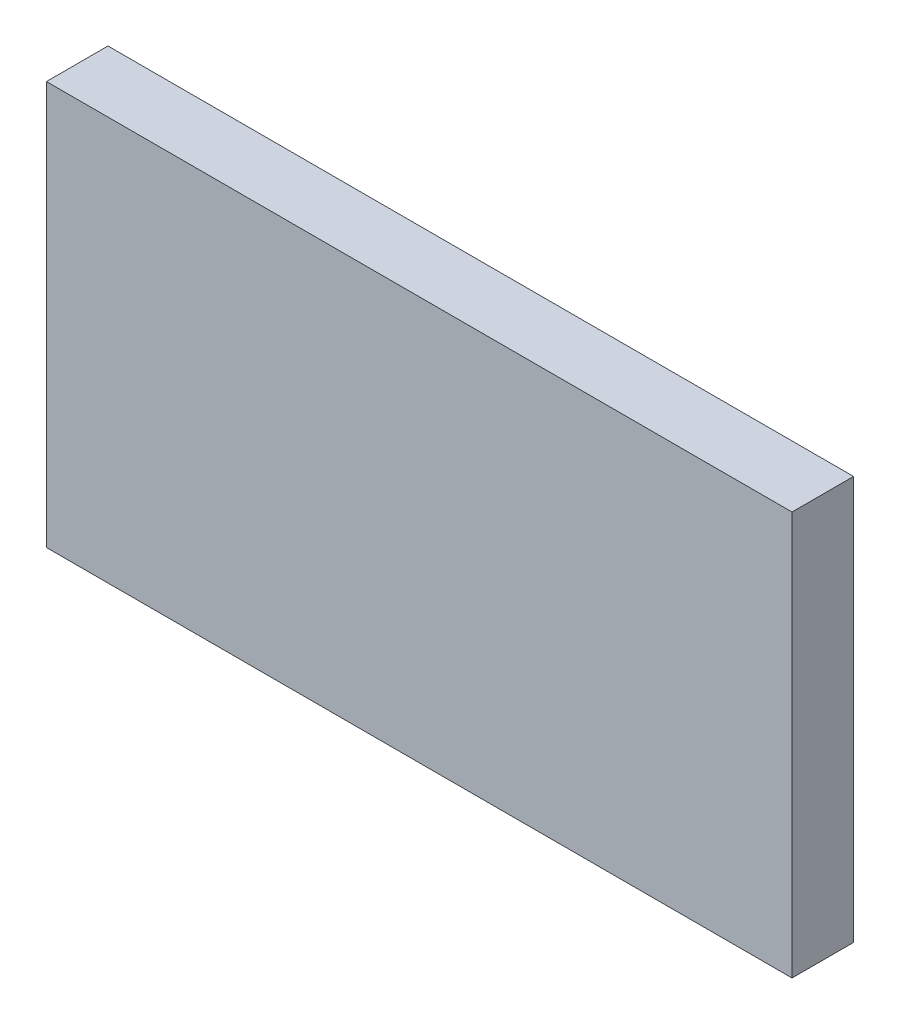
ISO-10303-21;
HEADER;
FILE_DESCRIPTION(('STEP AP214'),'2;1');
FILE_NAME('part.step','',(''),(''),'','','');
FILE_SCHEMA(('AUTOMOTIVE_DESIGN { 1 0 10303 214 1 1 1 1 }'));
ENDSEC;
DATA;
#1=APPLICATION_CONTEXT('core data for automotive mechanical design processes');
#2=APPLICATION_PROTOCOL_DEFINITION('international standard','automotive_design',2000,#1);
#3=PRODUCT_CONTEXT('',#1,'mechanical');
#4=PRODUCT('Part','Part','',(#3));
#5=PRODUCT_RELATED_PRODUCT_CATEGORY('part','',(#4));
#6=PRODUCT_DEFINITION_FORMATION('','',#4);
#7=PRODUCT_DEFINITION_CONTEXT('part definition',#1,'design');
#8=PRODUCT_DEFINITION('design','',#6,#7);
#9=PRODUCT_DEFINITION_SHAPE('','',#8);
#10=(LENGTH_UNIT() NAMED_UNIT(*) SI_UNIT(.MILLI.,.METRE.));
#11=(NAMED_UNIT(*) PLANE_ANGLE_UNIT() SI_UNIT($,.RADIAN.));
#12=(NAMED_UNIT(*) SI_UNIT($,.STERADIAN.) SOLID_ANGLE_UNIT());
#13=UNCERTAINTY_MEASURE_WITH_UNIT(LENGTH_MEASURE(1.E-05),#10,'distance_accuracy_value','');
#14=(GEOMETRIC_REPRESENTATION_CONTEXT(3) GLOBAL_UNCERTAINTY_ASSIGNED_CONTEXT((#13)) GLOBAL_UNIT_ASSIGNED_CONTEXT((#10,
#11,#12)) REPRESENTATION_CONTEXT('',''));
#15=CARTESIAN_POINT('',(0.,0.,0.));
#16=DIRECTION('',(0.,0.,1.));
#17=DIRECTION('',(1.,0.,0.));
#18=AXIS2_PLACEMENT_3D('',#15,#16,#17);
#19=CARTESIAN_POINT('',(0.,0.,0.));
#20=DIRECTION('',(0.,0.,1.));
#21=DIRECTION('',(1.,0.,0.));
#22=AXIS2_PLACEMENT_3D('',#19,#20,#21);
#23=PLANE('',#22);
#24=DIRECTION('',(0.,-1.,0.));
#25=VECTOR('',#24,1.);
#26=CARTESIAN_POINT('',(0.,0.,0.));
#27=LINE('',#26,#25);
#28=CARTESIAN_POINT('',(0.,0.,0.));
#29=VERTEX_POINT('',#28);
#30=CARTESIAN_POINT('',(0.,-59.,0.));
#31=VERTEX_POINT('',#30);
#32=EDGE_CURVE('E221',#29,#31,#27,.T.);
#33=ORIENTED_EDGE('',*,*,#32,.F.);
#34=DIRECTION('',(-1.,0.,0.));
#35=VECTOR('',#34,1.);
#36=CARTESIAN_POINT('',(0.,0.,0.));
#37=LINE('',#36,#35);
#38=CARTESIAN_POINT('',(109.,0.,0.));
#39=VERTEX_POINT('',#38);
#40=EDGE_CURVE('E236',#39,#29,#37,.T.);
#41=ORIENTED_EDGE('',*,*,#40,.F.);
#42=DIRECTION('',(0.,1.,0.));
#43=VECTOR('',#42,1.);
#44=CARTESIAN_POINT('',(109.,-59.,0.));
#45=LINE('',#44,#43);
#46=CARTESIAN_POINT('',(109.,-59.,0.));
#47=VERTEX_POINT('',#46);
#48=EDGE_CURVE('E247',#47,#39,#45,.T.);
#49=ORIENTED_EDGE('',*,*,#48,.F.);
#50=DIRECTION('',(1.,0.,0.));
#51=VECTOR('',#50,1.);
#52=CARTESIAN_POINT('',(0.,-59.,0.));
#53=LINE('',#52,#51);
#54=EDGE_CURVE('E245',#31,#47,#53,.T.);
#55=ORIENTED_EDGE('',*,*,#54,.F.);
#56=EDGE_LOOP('',(#33,#41,#49,#55));
#57=FACE_BOUND('',#56,.T.);
#58=DIRECTION('',(-1.,0.,0.));
#59=VECTOR('',#58,1.);
#60=CARTESIAN_POINT('',(3.,-3.,0.));
#61=LINE('',#60,#59);
#62=CARTESIAN_POINT('',(106.,-3.,0.));
#63=VERTEX_POINT('',#62);
#64=CARTESIAN_POINT('',(3.00000000000001,-3.,0.));
#65=VERTEX_POINT('',#64);
#66=EDGE_CURVE('E214',#63,#65,#61,.T.);
#67=ORIENTED_EDGE('',*,*,#66,.T.);
#68=DIRECTION('',(0.,-1.,0.));
#69=VECTOR('',#68,1.);
#70=CARTESIAN_POINT('',(3.,-3.,0.));
#71=LINE('',#70,#69);
#72=CARTESIAN_POINT('',(3.00000000000001,-56.,0.));
#73=VERTEX_POINT('',#72);
#74=EDGE_CURVE('E210',#65,#73,#71,.T.);
#75=ORIENTED_EDGE('',*,*,#74,.T.);
#76=DIRECTION('',(1.,0.,0.));
#77=VECTOR('',#76,1.);
#78=CARTESIAN_POINT('',(106.,-56.,0.));
#79=LINE('',#78,#77);
#80=CARTESIAN_POINT('',(106.,-56.,0.));
#81=VERTEX_POINT('',#80);
#82=EDGE_CURVE('E224',#73,#81,#79,.T.);
#83=ORIENTED_EDGE('',*,*,#82,.T.);
#84=DIRECTION('',(0.,1.,0.));
#85=VECTOR('',#84,1.);
#86=CARTESIAN_POINT('',(106.,-3.,0.));
#87=LINE('',#86,#85);
#88=EDGE_CURVE('E227',#81,#63,#87,.T.);
#89=ORIENTED_EDGE('',*,*,#88,.T.);
#90=EDGE_LOOP('',(#67,#75,#83,#89));
#91=FACE_BOUND('',#90,.T.);
#92=ADVANCED_FACE('F33',(#57,#91),#23,.F.);
#93=CARTESIAN_POINT('',(96.,-3.,9.));
#94=DIRECTION('',(1.,0.,0.));
#95=DIRECTION('',(0.,0.,-1.));
#96=AXIS2_PLACEMENT_3D('',#93,#94,#95);
#97=PLANE('',#96);
#98=DIRECTION('',(0.,-1.,0.));
#99=VECTOR('',#98,1.);
#100=CARTESIAN_POINT('',(96.,-13.,2.));
#101=LINE('',#100,#99);
#102=CARTESIAN_POINT('',(96.,-3.,2.));
#103=VERTEX_POINT('',#102);
#104=CARTESIAN_POINT('',(96.,-13.,2.));
#105=VERTEX_POINT('',#104);
#106=EDGE_CURVE('E286',#103,#105,#101,.T.);
#107=ORIENTED_EDGE('',*,*,#106,.T.);
#108=DIRECTION('',(0.,0.,-1.));
#109=VECTOR('',#108,1.);
#110=CARTESIAN_POINT('',(96.,-13.,9.));
#111=LINE('',#110,#109);
#112=CARTESIAN_POINT('',(96.,-13.,7.99999999999999));
#113=VERTEX_POINT('',#112);
#114=EDGE_CURVE('E204',#113,#105,#111,.T.);
#115=ORIENTED_EDGE('',*,*,#114,.F.);
#116=DIRECTION('',(0.,-1.,0.));
#117=VECTOR('',#116,1.);
#118=CARTESIAN_POINT('',(96.,0.,7.99999999999999));
#119=LINE('',#118,#117);
#120=CARTESIAN_POINT('',(96.,-3.,7.99999999999999));
#121=VERTEX_POINT('',#120);
#122=EDGE_CURVE('E264',#121,#113,#119,.T.);
#123=ORIENTED_EDGE('',*,*,#122,.F.);
#124=DIRECTION('',(0.,0.,-1.));
#125=VECTOR('',#124,1.);
#126=CARTESIAN_POINT('',(96.,-3.,9.));
#127=LINE('',#126,#125);
#128=EDGE_CURVE('E207',#121,#103,#127,.T.);
#129=ORIENTED_EDGE('',*,*,#128,.T.);
#130=EDGE_LOOP('',(#107,#115,#123,#129));
#131=FACE_BOUND('',#130,.T.);
#132=ADVANCED_FACE('F359',(#131),#97,.F.);
#133=CARTESIAN_POINT('',(96.,-13.,9.));
#134=DIRECTION('',(0.,1.,0.));
#135=DIRECTION('',(-1.,0.,0.));
#136=AXIS2_PLACEMENT_3D('',#133,#134,#135);
#137=PLANE('',#136);
#138=DIRECTION('',(1.,0.,0.));
#139=VECTOR('',#138,1.);
#140=CARTESIAN_POINT('',(106.,-13.,2.));
#141=LINE('',#140,#139);
#142=CARTESIAN_POINT('',(106.,-13.,2.));
#143=VERTEX_POINT('',#142);
#144=EDGE_CURVE('E282',#105,#143,#141,.T.);
#145=ORIENTED_EDGE('',*,*,#144,.T.);
#146=DIRECTION('',(0.,0.,-1.));
#147=VECTOR('',#146,1.);
#148=CARTESIAN_POINT('',(106.,-13.,9.));
#149=LINE('',#148,#147);
#150=CARTESIAN_POINT('',(106.,-13.,7.99999999999999));
#151=VERTEX_POINT('',#150);
#152=EDGE_CURVE('E201',#151,#143,#149,.T.);
#153=ORIENTED_EDGE('',*,*,#152,.F.);
#154=DIRECTION('',(1.,0.,0.));
#155=VECTOR('',#154,1.);
#156=CARTESIAN_POINT('',(0.,-13.,7.99999999999999));
#157=LINE('',#156,#155);
#158=EDGE_CURVE('E261',#113,#151,#157,.T.);
#159=ORIENTED_EDGE('',*,*,#158,.F.);
#160=ORIENTED_EDGE('',*,*,#114,.T.);
#161=EDGE_LOOP('',(#145,#153,#159,#160));
#162=FACE_BOUND('',#161,.T.);
#163=ADVANCED_FACE('F280',(#162),#137,.F.);
#164=CARTESIAN_POINT('',(13.,-56.,9.));
#165=DIRECTION('',(-1.,0.,0.));
#166=DIRECTION('',(0.,0.,1.));
#167=AXIS2_PLACEMENT_3D('',#164,#165,#166);
#168=PLANE('',#167);
#169=DIRECTION('',(0.,1.,0.));
#170=VECTOR('',#169,1.);
#171=CARTESIAN_POINT('',(13.,-46.,2.));
#172=LINE('',#171,#170);
#173=CARTESIAN_POINT('',(13.,-56.,2.));
#174=VERTEX_POINT('',#173);
#175=CARTESIAN_POINT('',(13.,-46.,2.));
#176=VERTEX_POINT('',#175);
#177=EDGE_CURVE('E327',#174,#176,#172,.T.);
#178=ORIENTED_EDGE('',*,*,#177,.T.);
#179=DIRECTION('',(0.,0.,-1.));
#180=VECTOR('',#179,1.);
#181=CARTESIAN_POINT('',(13.,-46.,9.));
#182=LINE('',#181,#180);
#183=CARTESIAN_POINT('',(13.,-46.,7.99999999999999));
#184=VERTEX_POINT('',#183);
#185=EDGE_CURVE('E309',#184,#176,#182,.T.);
#186=ORIENTED_EDGE('',*,*,#185,.F.);
#187=DIRECTION('',(0.,1.,0.));
#188=VECTOR('',#187,1.);
#189=CARTESIAN_POINT('',(13.,0.,7.99999999999999));
#190=LINE('',#189,#188);
#191=CARTESIAN_POINT('',(13.,-56.,7.99999999999999));
#192=VERTEX_POINT('',#191);
#193=EDGE_CURVE('E196',#192,#184,#190,.T.);
#194=ORIENTED_EDGE('',*,*,#193,.F.);
#195=DIRECTION('',(0.,0.,-1.));
#196=VECTOR('',#195,1.);
#197=CARTESIAN_POINT('',(13.,-56.,9.));
#198=LINE('',#197,#196);
#199=EDGE_CURVE('E312',#192,#174,#198,.T.);
#200=ORIENTED_EDGE('',*,*,#199,.T.);
#201=EDGE_LOOP('',(#178,#186,#194,#200));
#202=FACE_BOUND('',#201,.T.);
#203=ADVANCED_FACE('F320',(#202),#168,.F.);
#204=CARTESIAN_POINT('',(13.,-46.,9.));
#205=DIRECTION('',(0.,-1.,0.));
#206=DIRECTION('',(0.,0.,-1.));
#207=AXIS2_PLACEMENT_3D('',#204,#205,#206);
#208=PLANE('',#207);
#209=DIRECTION('',(-1.,0.,0.));
#210=VECTOR('',#209,1.);
#211=CARTESIAN_POINT('',(3.00000000000001,-46.,2.));
#212=LINE('',#211,#210);
#213=CARTESIAN_POINT('',(3.00000000000001,-46.,2.));
#214=VERTEX_POINT('',#213);
#215=EDGE_CURVE('E332',#176,#214,#212,.T.);
#216=ORIENTED_EDGE('',*,*,#215,.T.);
#217=DIRECTION('',(0.,0.,-1.));
#218=VECTOR('',#217,1.);
#219=CARTESIAN_POINT('',(3.00000000000001,-46.,7.99999999999999));
#220=LINE('',#219,#218);
#221=CARTESIAN_POINT('',(3.00000000000001,-46.,7.99999999999999));
#222=VERTEX_POINT('',#221);
#223=EDGE_CURVE('E11',#222,#214,#220,.T.);
#224=ORIENTED_EDGE('',*,*,#223,.F.);
#225=DIRECTION('',(-1.,0.,0.));
#226=VECTOR('',#225,1.);
#227=CARTESIAN_POINT('',(0.,-46.,7.99999999999999));
#228=LINE('',#227,#226);
#229=EDGE_CURVE('E315',#184,#222,#228,.T.);
#230=ORIENTED_EDGE('',*,*,#229,.F.);
#231=ORIENTED_EDGE('',*,*,#185,.T.);
#232=EDGE_LOOP('',(#216,#224,#230,#231));
#233=FACE_BOUND('',#232,.T.);
#234=ADVANCED_FACE('F378',(#233),#208,.F.);
#235=CARTESIAN_POINT('',(0.,0.,7.99999999999999));
#236=DIRECTION('',(0.,0.,-1.));
#237=DIRECTION('',(-1.,0.,0.));
#238=AXIS2_PLACEMENT_3D('',#235,#236,#237);
#239=PLANE('',#238);
#240=DIRECTION('',(0.,-1.,0.));
#241=VECTOR('',#240,1.);
#242=CARTESIAN_POINT('',(3.,-3.,7.99999999999999));
#243=LINE('',#242,#241);
#244=CARTESIAN_POINT('',(3.,-13.,7.99999999999999));
#245=VERTEX_POINT('',#244);
#246=EDGE_CURVE('E211',#245,#222,#243,.T.);
#247=ORIENTED_EDGE('',*,*,#246,.F.);
#248=DIRECTION('',(1.,0.,0.));
#249=VECTOR('',#248,1.);
#250=CARTESIAN_POINT('',(0.,-13.,7.99999999999999));
#251=LINE('',#250,#249);
#252=CARTESIAN_POINT('',(13.,-13.,7.99999999999999));
#253=VERTEX_POINT('',#252);
#254=EDGE_CURVE('E306',#245,#253,#251,.T.);
#255=ORIENTED_EDGE('',*,*,#254,.T.);
#256=DIRECTION('',(0.,1.,0.));
#257=VECTOR('',#256,1.);
#258=CARTESIAN_POINT('',(13.,0.,7.99999999999999));
#259=LINE('',#258,#257);
#260=CARTESIAN_POINT('',(13.,-3.,7.99999999999999));
#261=VERTEX_POINT('',#260);
#262=EDGE_CURVE('E303',#253,#261,#259,.T.);
#263=ORIENTED_EDGE('',*,*,#262,.T.);
#264=DIRECTION('',(-1.,0.,0.));
#265=VECTOR('',#264,1.);
#266=CARTESIAN_POINT('',(3.,-3.,7.99999999999999));
#267=LINE('',#266,#265);
#268=EDGE_CURVE('E218',#121,#261,#267,.T.);
#269=ORIENTED_EDGE('',*,*,#268,.F.);
#270=ORIENTED_EDGE('',*,*,#122,.T.);
#271=ORIENTED_EDGE('',*,*,#158,.T.);
#272=DIRECTION('',(0.,1.,0.));
#273=VECTOR('',#272,1.);
#274=CARTESIAN_POINT('',(106.,-3.,7.99999999999999));
#275=LINE('',#274,#273);
#276=CARTESIAN_POINT('',(106.,-46.,7.99999999999999));
#277=VERTEX_POINT('',#276);
#278=EDGE_CURVE('E216',#277,#151,#275,.T.);
#279=ORIENTED_EDGE('',*,*,#278,.F.);
#280=DIRECTION('',(-1.,0.,0.));
#281=VECTOR('',#280,1.);
#282=CARTESIAN_POINT('',(0.,-46.,7.99999999999999));
#283=LINE('',#282,#281);
#284=CARTESIAN_POINT('',(96.,-46.,7.99999999999999));
#285=VERTEX_POINT('',#284);
#286=EDGE_CURVE('E190',#277,#285,#283,.T.);
#287=ORIENTED_EDGE('',*,*,#286,.T.);
#288=DIRECTION('',(0.,-1.,0.));
#289=VECTOR('',#288,1.);
#290=CARTESIAN_POINT('',(96.,0.,7.99999999999999));
#291=LINE('',#290,#289);
#292=CARTESIAN_POINT('',(96.,-56.,7.99999999999999));
#293=VERTEX_POINT('',#292);
#294=EDGE_CURVE('E191',#285,#293,#291,.T.);
#295=ORIENTED_EDGE('',*,*,#294,.T.);
#296=DIRECTION('',(1.,0.,0.));
#297=VECTOR('',#296,1.);
#298=CARTESIAN_POINT('',(106.,-56.,7.99999999999999));
#299=LINE('',#298,#297);
#300=EDGE_CURVE('E213',#192,#293,#299,.T.);
#301=ORIENTED_EDGE('',*,*,#300,.F.);
#302=ORIENTED_EDGE('',*,*,#193,.T.);
#303=ORIENTED_EDGE('',*,*,#229,.T.);
#304=EDGE_LOOP('',(#247,#255,#263,#269,#270,#271,#279,#287,#295,#301,#302,#303));
#305=FACE_BOUND('',#304,.T.);
#306=ADVANCED_FACE('F276',(#305),#239,.T.);
#307=CARTESIAN_POINT('',(3.,-3.,7.99999999999999));
#308=DIRECTION('',(1.,0.,0.));
#309=DIRECTION('',(0.,1.,0.));
#310=AXIS2_PLACEMENT_3D('',#307,#308,#309);
#311=PLANE('',#310);
#312=ORIENTED_EDGE('',*,*,#74,.F.);
#313=DIRECTION('',(0.,0.,-1.));
#314=VECTOR('',#313,1.);
#315=CARTESIAN_POINT('',(3.00000000000001,-3.,2.));
#316=LINE('',#315,#314);
#317=CARTESIAN_POINT('',(3.00000000000001,-3.,2.));
#318=VERTEX_POINT('',#317);
#319=EDGE_CURVE('E349',#318,#65,#316,.T.);
#320=ORIENTED_EDGE('',*,*,#319,.F.);
#321=DIRECTION('',(0.,-1.,0.));
#322=VECTOR('',#321,1.);
#323=CARTESIAN_POINT('',(3.00000000000001,-3.,2.));
#324=LINE('',#323,#322);
#325=CARTESIAN_POINT('',(3.,-13.,2.));
#326=VERTEX_POINT('',#325);
#327=EDGE_CURVE('E338',#318,#326,#324,.T.);
#328=ORIENTED_EDGE('',*,*,#327,.T.);
#329=DIRECTION('',(0.,0.,-1.));
#330=VECTOR('',#329,1.);
#331=CARTESIAN_POINT('',(3.,-13.,9.));
#332=LINE('',#331,#330);
#333=EDGE_CURVE('E300',#245,#326,#332,.T.);
#334=ORIENTED_EDGE('',*,*,#333,.F.);
#335=ORIENTED_EDGE('',*,*,#246,.T.);
#336=ORIENTED_EDGE('',*,*,#223,.T.);
#337=DIRECTION('',(0.,-1.,0.));
#338=VECTOR('',#337,1.);
#339=CARTESIAN_POINT('',(3.00000000000001,-56.,2.));
#340=LINE('',#339,#338);
#341=CARTESIAN_POINT('',(3.00000000000001,-56.,2.));
#342=VERTEX_POINT('',#341);
#343=EDGE_CURVE('E328',#214,#342,#340,.T.);
#344=ORIENTED_EDGE('',*,*,#343,.T.);
#345=DIRECTION('',(0.,0.,-1.));
#346=VECTOR('',#345,1.);
#347=CARTESIAN_POINT('',(3.00000000000001,-56.,2.));
#348=LINE('',#347,#346);
#349=EDGE_CURVE('E186',#342,#73,#348,.T.);
#350=ORIENTED_EDGE('',*,*,#349,.T.);
#351=EDGE_LOOP('',(#312,#320,#328,#334,#335,#336,#344,#350));
#352=FACE_BOUND('',#351,.T.);
#353=ADVANCED_FACE('F371',(#352),#311,.T.);
#354=CARTESIAN_POINT('',(3.,-3.,7.99999999999999));
#355=DIRECTION('',(0.,-1.,0.));
#356=DIRECTION('',(0.,0.,-1.));
#357=AXIS2_PLACEMENT_3D('',#354,#355,#356);
#358=PLANE('',#357);
#359=ORIENTED_EDGE('',*,*,#268,.T.);
#360=DIRECTION('',(0.,0.,-1.));
#361=VECTOR('',#360,1.);
#362=CARTESIAN_POINT('',(13.,-3.,9.));
#363=LINE('',#362,#361);
#364=CARTESIAN_POINT('',(13.,-3.,2.));
#365=VERTEX_POINT('',#364);
#366=EDGE_CURVE('E289',#261,#365,#363,.T.);
#367=ORIENTED_EDGE('',*,*,#366,.T.);
#368=DIRECTION('',(-1.,0.,0.));
#369=VECTOR('',#368,1.);
#370=CARTESIAN_POINT('',(13.,-3.,2.));
#371=LINE('',#370,#369);
#372=EDGE_CURVE('E347',#365,#318,#371,.T.);
#373=ORIENTED_EDGE('',*,*,#372,.T.);
#374=ORIENTED_EDGE('',*,*,#319,.T.);
#375=ORIENTED_EDGE('',*,*,#66,.F.);
#376=DIRECTION('',(0.,0.,-1.));
#377=VECTOR('',#376,1.);
#378=CARTESIAN_POINT('',(106.,-3.,2.));
#379=LINE('',#378,#377);
#380=CARTESIAN_POINT('',(106.,-3.,2.));
#381=VERTEX_POINT('',#380);
#382=EDGE_CURVE('E285',#381,#63,#379,.T.);
#383=ORIENTED_EDGE('',*,*,#382,.F.);
#384=DIRECTION('',(-1.,0.,0.));
#385=VECTOR('',#384,1.);
#386=CARTESIAN_POINT('',(96.,-3.,2.));
#387=LINE('',#386,#385);
#388=EDGE_CURVE('E291',#381,#103,#387,.T.);
#389=ORIENTED_EDGE('',*,*,#388,.T.);
#390=ORIENTED_EDGE('',*,*,#128,.F.);
#391=EDGE_LOOP('',(#359,#367,#373,#374,#375,#383,#389,#390));
#392=FACE_BOUND('',#391,.T.);
#393=ADVANCED_FACE('F355',(#392),#358,.T.);
#394=CARTESIAN_POINT('',(106.,-56.,7.99999999999999));
#395=DIRECTION('',(0.,1.,0.));
#396=DIRECTION('',(0.,0.,1.));
#397=AXIS2_PLACEMENT_3D('',#394,#395,#396);
#398=PLANE('',#397);
#399=ORIENTED_EDGE('',*,*,#82,.F.);
#400=ORIENTED_EDGE('',*,*,#349,.F.);
#401=DIRECTION('',(1.,0.,0.));
#402=VECTOR('',#401,1.);
#403=CARTESIAN_POINT('',(13.,-56.,2.));
#404=LINE('',#403,#402);
#405=EDGE_CURVE('E322',#342,#174,#404,.T.);
#406=ORIENTED_EDGE('',*,*,#405,.T.);
#407=ORIENTED_EDGE('',*,*,#199,.F.);
#408=ORIENTED_EDGE('',*,*,#300,.T.);
#409=DIRECTION('',(0.,0.,-1.));
#410=VECTOR('',#409,1.);
#411=CARTESIAN_POINT('',(96.,-56.,7.99999999999999));
#412=LINE('',#411,#410);
#413=CARTESIAN_POINT('',(96.,-56.,2.));
#414=VERTEX_POINT('',#413);
#415=EDGE_CURVE('E41',#293,#414,#412,.T.);
#416=ORIENTED_EDGE('',*,*,#415,.T.);
#417=DIRECTION('',(1.,0.,0.));
#418=VECTOR('',#417,1.);
#419=CARTESIAN_POINT('',(96.,-56.,2.));
#420=LINE('',#419,#418);
#421=CARTESIAN_POINT('',(106.,-56.,2.));
#422=VERTEX_POINT('',#421);
#423=EDGE_CURVE('E56',#414,#422,#420,.T.);
#424=ORIENTED_EDGE('',*,*,#423,.T.);
#425=DIRECTION('',(0.,0.,-1.));
#426=VECTOR('',#425,1.);
#427=CARTESIAN_POINT('',(106.,-56.,2.));
#428=LINE('',#427,#426);
#429=EDGE_CURVE('E185',#422,#81,#428,.T.);
#430=ORIENTED_EDGE('',*,*,#429,.T.);
#431=EDGE_LOOP('',(#399,#400,#406,#407,#408,#416,#424,#430));
#432=FACE_BOUND('',#431,.T.);
#433=ADVANCED_FACE('F269',(#432),#398,.T.);
#434=CARTESIAN_POINT('',(106.,-3.,7.99999999999999));
#435=DIRECTION('',(-1.,0.,0.));
#436=DIRECTION('',(0.,0.,1.));
#437=AXIS2_PLACEMENT_3D('',#434,#435,#436);
#438=PLANE('',#437);
#439=ORIENTED_EDGE('',*,*,#88,.F.);
#440=ORIENTED_EDGE('',*,*,#429,.F.);
#441=DIRECTION('',(0.,1.,0.));
#442=VECTOR('',#441,1.);
#443=CARTESIAN_POINT('',(106.,-56.,2.));
#444=LINE('',#443,#442);
#445=CARTESIAN_POINT('',(106.,-46.,2.));
#446=VERTEX_POINT('',#445);
#447=EDGE_CURVE('E171',#422,#446,#444,.T.);
#448=ORIENTED_EDGE('',*,*,#447,.T.);
#449=DIRECTION('',(0.,0.,-1.));
#450=VECTOR('',#449,1.);
#451=CARTESIAN_POINT('',(106.,-46.,9.));
#452=LINE('',#451,#450);
#453=EDGE_CURVE('E182',#277,#446,#452,.T.);
#454=ORIENTED_EDGE('',*,*,#453,.F.);
#455=ORIENTED_EDGE('',*,*,#278,.T.);
#456=ORIENTED_EDGE('',*,*,#152,.T.);
#457=DIRECTION('',(0.,1.,0.));
#458=VECTOR('',#457,1.);
#459=CARTESIAN_POINT('',(106.,-3.,2.));
#460=LINE('',#459,#458);
#461=EDGE_CURVE('E48',#143,#381,#460,.T.);
#462=ORIENTED_EDGE('',*,*,#461,.T.);
#463=ORIENTED_EDGE('',*,*,#382,.T.);
#464=EDGE_LOOP('',(#439,#440,#448,#454,#455,#456,#462,#463));
#465=FACE_BOUND('',#464,.T.);
#466=ADVANCED_FACE('F181',(#465),#438,.T.);
#467=CARTESIAN_POINT('',(0.,0.,9.));
#468=DIRECTION('',(1.,0.,0.));
#469=DIRECTION('',(0.,1.,0.));
#470=AXIS2_PLACEMENT_3D('',#467,#468,#469);
#471=PLANE('',#470);
#472=ORIENTED_EDGE('',*,*,#32,.T.);
#473=DIRECTION('',(0.,0.,-1.));
#474=VECTOR('',#473,1.);
#475=CARTESIAN_POINT('',(0.,-59.,9.));
#476=LINE('',#475,#474);
#477=CARTESIAN_POINT('',(0.,-59.,9.));
#478=VERTEX_POINT('',#477);
#479=EDGE_CURVE('E258',#478,#31,#476,.T.);
#480=ORIENTED_EDGE('',*,*,#479,.F.);
#481=DIRECTION('',(0.,-1.,0.));
#482=VECTOR('',#481,1.);
#483=CARTESIAN_POINT('',(0.,0.,9.));
#484=LINE('',#483,#482);
#485=CARTESIAN_POINT('',(0.,0.,9.));
#486=VERTEX_POINT('',#485);
#487=EDGE_CURVE('E232',#486,#478,#484,.T.);
#488=ORIENTED_EDGE('',*,*,#487,.F.);
#489=DIRECTION('',(0.,0.,-1.));
#490=VECTOR('',#489,1.);
#491=CARTESIAN_POINT('',(0.,0.,9.));
#492=LINE('',#491,#490);
#493=EDGE_CURVE('E242',#486,#29,#492,.T.);
#494=ORIENTED_EDGE('',*,*,#493,.T.);
#495=EDGE_LOOP('',(#472,#480,#488,#494));
#496=FACE_BOUND('',#495,.T.);
#497=ADVANCED_FACE('F35',(#496),#471,.F.);
#498=CARTESIAN_POINT('',(0.,-59.,9.));
#499=DIRECTION('',(0.,1.,0.));
#500=DIRECTION('',(0.,0.,1.));
#501=AXIS2_PLACEMENT_3D('',#498,#499,#500);
#502=PLANE('',#501);
#503=ORIENTED_EDGE('',*,*,#54,.T.);
#504=DIRECTION('',(0.,0.,-1.));
#505=VECTOR('',#504,1.);
#506=CARTESIAN_POINT('',(109.,-59.,9.));
#507=LINE('',#506,#505);
#508=CARTESIAN_POINT('',(109.,-59.,9.));
#509=VERTEX_POINT('',#508);
#510=EDGE_CURVE('E255',#509,#47,#507,.T.);
#511=ORIENTED_EDGE('',*,*,#510,.F.);
#512=DIRECTION('',(1.,0.,0.));
#513=VECTOR('',#512,1.);
#514=CARTESIAN_POINT('',(0.,-59.,9.));
#515=LINE('',#514,#513);
#516=EDGE_CURVE('E235',#478,#509,#515,.T.);
#517=ORIENTED_EDGE('',*,*,#516,.F.);
#518=ORIENTED_EDGE('',*,*,#479,.T.);
#519=EDGE_LOOP('',(#503,#511,#517,#518));
#520=FACE_BOUND('',#519,.T.);
#521=ADVANCED_FACE('F406',(#520),#502,.F.);
#522=CARTESIAN_POINT('',(109.,-59.,9.));
#523=DIRECTION('',(-1.,0.,0.));
#524=DIRECTION('',(0.,0.,1.));
#525=AXIS2_PLACEMENT_3D('',#522,#523,#524);
#526=PLANE('',#525);
#527=ORIENTED_EDGE('',*,*,#48,.T.);
#528=DIRECTION('',(0.,0.,-1.));
#529=VECTOR('',#528,1.);
#530=CARTESIAN_POINT('',(109.,0.,9.));
#531=LINE('',#530,#529);
#532=CARTESIAN_POINT('',(109.,0.,9.));
#533=VERTEX_POINT('',#532);
#534=EDGE_CURVE('E252',#533,#39,#531,.T.);
#535=ORIENTED_EDGE('',*,*,#534,.F.);
#536=DIRECTION('',(0.,1.,0.));
#537=VECTOR('',#536,1.);
#538=CARTESIAN_POINT('',(109.,-59.,9.));
#539=LINE('',#538,#537);
#540=EDGE_CURVE('E238',#509,#533,#539,.T.);
#541=ORIENTED_EDGE('',*,*,#540,.F.);
#542=ORIENTED_EDGE('',*,*,#510,.T.);
#543=EDGE_LOOP('',(#527,#535,#541,#542));
#544=FACE_BOUND('',#543,.T.);
#545=ADVANCED_FACE('F403',(#544),#526,.F.);
#546=CARTESIAN_POINT('',(0.,0.,9.));
#547=DIRECTION('',(0.,-1.,0.));
#548=DIRECTION('',(0.,0.,-1.));
#549=AXIS2_PLACEMENT_3D('',#546,#547,#548);
#550=PLANE('',#549);
#551=ORIENTED_EDGE('',*,*,#40,.T.);
#552=ORIENTED_EDGE('',*,*,#493,.F.);
#553=DIRECTION('',(-1.,0.,0.));
#554=VECTOR('',#553,1.);
#555=CARTESIAN_POINT('',(0.,0.,9.));
#556=LINE('',#555,#554);
#557=EDGE_CURVE('E240',#533,#486,#556,.T.);
#558=ORIENTED_EDGE('',*,*,#557,.F.);
#559=ORIENTED_EDGE('',*,*,#534,.T.);
#560=EDGE_LOOP('',(#551,#552,#558,#559));
#561=FACE_BOUND('',#560,.T.);
#562=ADVANCED_FACE('F400',(#561),#550,.F.);
#563=CARTESIAN_POINT('',(0.,0.,9.));
#564=DIRECTION('',(0.,0.,1.));
#565=DIRECTION('',(1.,0.,0.));
#566=AXIS2_PLACEMENT_3D('',#563,#564,#565);
#567=PLANE('',#566);
#568=ORIENTED_EDGE('',*,*,#487,.T.);
#569=ORIENTED_EDGE('',*,*,#516,.T.);
#570=ORIENTED_EDGE('',*,*,#540,.T.);
#571=ORIENTED_EDGE('',*,*,#557,.T.);
#572=EDGE_LOOP('',(#568,#569,#570,#571));
#573=FACE_BOUND('',#572,.T.);
#574=ADVANCED_FACE('F398',(#573),#567,.T.);
#575=CARTESIAN_POINT('',(96.,-46.,9.));
#576=DIRECTION('',(0.,-1.,0.));
#577=DIRECTION('',(0.,0.,-1.));
#578=AXIS2_PLACEMENT_3D('',#575,#576,#577);
#579=PLANE('',#578);
#580=ORIENTED_EDGE('',*,*,#453,.T.);
#581=DIRECTION('',(-1.,0.,0.));
#582=VECTOR('',#581,1.);
#583=CARTESIAN_POINT('',(106.,-46.,2.));
#584=LINE('',#583,#582);
#585=CARTESIAN_POINT('',(96.,-46.,2.));
#586=VERTEX_POINT('',#585);
#587=EDGE_CURVE('E168',#446,#586,#584,.T.);
#588=ORIENTED_EDGE('',*,*,#587,.T.);
#589=DIRECTION('',(0.,0.,-1.));
#590=VECTOR('',#589,1.);
#591=CARTESIAN_POINT('',(96.,-46.,9.));
#592=LINE('',#591,#590);
#593=EDGE_CURVE('E192',#285,#586,#592,.T.);
#594=ORIENTED_EDGE('',*,*,#593,.F.);
#595=ORIENTED_EDGE('',*,*,#286,.F.);
#596=EDGE_LOOP('',(#580,#588,#594,#595));
#597=FACE_BOUND('',#596,.T.);
#598=ADVANCED_FACE('F188',(#597),#579,.F.);
#599=CARTESIAN_POINT('',(96.,-56.,9.));
#600=DIRECTION('',(1.,0.,0.));
#601=DIRECTION('',(0.,0.,-1.));
#602=AXIS2_PLACEMENT_3D('',#599,#600,#601);
#603=PLANE('',#602);
#604=ORIENTED_EDGE('',*,*,#593,.T.);
#605=DIRECTION('',(0.,-1.,0.));
#606=VECTOR('',#605,1.);
#607=CARTESIAN_POINT('',(96.,-46.,2.));
#608=LINE('',#607,#606);
#609=EDGE_CURVE('E172',#586,#414,#608,.T.);
#610=ORIENTED_EDGE('',*,*,#609,.T.);
#611=ORIENTED_EDGE('',*,*,#415,.F.);
#612=ORIENTED_EDGE('',*,*,#294,.F.);
#613=EDGE_LOOP('',(#604,#610,#611,#612));
#614=FACE_BOUND('',#613,.T.);
#615=ADVANCED_FACE('F273',(#614),#603,.F.);
#616=CARTESIAN_POINT('',(13.,-13.,9.));
#617=DIRECTION('',(0.,1.,0.));
#618=DIRECTION('',(0.,0.,1.));
#619=AXIS2_PLACEMENT_3D('',#616,#617,#618);
#620=PLANE('',#619);
#621=ORIENTED_EDGE('',*,*,#333,.T.);
#622=DIRECTION('',(1.,0.,0.));
#623=VECTOR('',#622,1.);
#624=CARTESIAN_POINT('',(3.,-13.,2.));
#625=LINE('',#624,#623);
#626=CARTESIAN_POINT('',(13.,-13.,2.));
#627=VERTEX_POINT('',#626);
#628=EDGE_CURVE('E341',#326,#627,#625,.T.);
#629=ORIENTED_EDGE('',*,*,#628,.T.);
#630=DIRECTION('',(0.,0.,-1.));
#631=VECTOR('',#630,1.);
#632=CARTESIAN_POINT('',(13.,-13.,9.));
#633=LINE('',#632,#631);
#634=EDGE_CURVE('E297',#253,#627,#633,.T.);
#635=ORIENTED_EDGE('',*,*,#634,.F.);
#636=ORIENTED_EDGE('',*,*,#254,.F.);
#637=EDGE_LOOP('',(#621,#629,#635,#636));
#638=FACE_BOUND('',#637,.T.);
#639=ADVANCED_FACE('F368',(#638),#620,.F.);
#640=CARTESIAN_POINT('',(13.,-3.,9.));
#641=DIRECTION('',(-1.,0.,0.));
#642=DIRECTION('',(0.,0.,1.));
#643=AXIS2_PLACEMENT_3D('',#640,#641,#642);
#644=PLANE('',#643);
#645=ORIENTED_EDGE('',*,*,#634,.T.);
#646=DIRECTION('',(0.,1.,0.));
#647=VECTOR('',#646,1.);
#648=CARTESIAN_POINT('',(13.,-13.,2.));
#649=LINE('',#648,#647);
#650=EDGE_CURVE('E344',#627,#365,#649,.T.);
#651=ORIENTED_EDGE('',*,*,#650,.T.);
#652=ORIENTED_EDGE('',*,*,#366,.F.);
#653=ORIENTED_EDGE('',*,*,#262,.F.);
#654=EDGE_LOOP('',(#645,#651,#652,#653));
#655=FACE_BOUND('',#654,.T.);
#656=ADVANCED_FACE('F362',(#655),#644,.F.);
#657=CARTESIAN_POINT('',(0.,0.,2.));
#658=DIRECTION('',(0.,0.,1.));
#659=DIRECTION('',(1.,0.,0.));
#660=AXIS2_PLACEMENT_3D('',#657,#658,#659);
#661=PLANE('',#660);
#662=ORIENTED_EDGE('',*,*,#327,.F.);
#663=ORIENTED_EDGE('',*,*,#372,.F.);
#664=ORIENTED_EDGE('',*,*,#650,.F.);
#665=ORIENTED_EDGE('',*,*,#628,.F.);
#666=EDGE_LOOP('',(#662,#663,#664,#665));
#667=FACE_BOUND('',#666,.T.);
#668=ADVANCED_FACE('F366',(#667),#661,.F.);
#669=CARTESIAN_POINT('',(0.,0.,2.));
#670=DIRECTION('',(0.,0.,-1.));
#671=DIRECTION('',(-1.,0.,0.));
#672=AXIS2_PLACEMENT_3D('',#669,#670,#671);
#673=PLANE('',#672);
#674=ORIENTED_EDGE('',*,*,#343,.F.);
#675=ORIENTED_EDGE('',*,*,#215,.F.);
#676=ORIENTED_EDGE('',*,*,#177,.F.);
#677=ORIENTED_EDGE('',*,*,#405,.F.);
#678=EDGE_LOOP('',(#674,#675,#676,#677));
#679=FACE_BOUND('',#678,.T.);
#680=ADVANCED_FACE('F330',(#679),#673,.T.);
#681=CARTESIAN_POINT('',(0.,0.,2.));
#682=DIRECTION('',(0.,0.,1.));
#683=DIRECTION('',(1.,0.,0.));
#684=AXIS2_PLACEMENT_3D('',#681,#682,#683);
#685=PLANE('',#684);
#686=ORIENTED_EDGE('',*,*,#447,.F.);
#687=ORIENTED_EDGE('',*,*,#423,.F.);
#688=ORIENTED_EDGE('',*,*,#609,.F.);
#689=ORIENTED_EDGE('',*,*,#587,.F.);
#690=EDGE_LOOP('',(#686,#687,#688,#689));
#691=FACE_BOUND('',#690,.T.);
#692=ADVANCED_FACE('F170',(#691),#685,.F.);
#693=CARTESIAN_POINT('',(0.,0.,2.));
#694=DIRECTION('',(0.,0.,-1.));
#695=DIRECTION('',(-1.,0.,0.));
#696=AXIS2_PLACEMENT_3D('',#693,#694,#695);
#697=PLANE('',#696);
#698=ORIENTED_EDGE('',*,*,#461,.F.);
#699=ORIENTED_EDGE('',*,*,#144,.F.);
#700=ORIENTED_EDGE('',*,*,#106,.F.);
#701=ORIENTED_EDGE('',*,*,#388,.F.);
#702=EDGE_LOOP('',(#698,#699,#700,#701));
#703=FACE_BOUND('',#702,.T.);
#704=ADVANCED_FACE('F357',(#703),#697,.T.);
#705=CLOSED_SHELL('',(#92,#132,#163,#203,#234,#306,#353,#393,#433,#466,#497,#521,#545,#562,#574,
#598,#615,#639,#656,#668,#680,#692,#704));
#706=MANIFOLD_SOLID_BREP('B2',#705);
#707=ADVANCED_BREP_SHAPE_REPRESENTATION('',(#18,#706),#14);
#708=SHAPE_DEFINITION_REPRESENTATION(#9,#707);
ENDSEC;
END-ISO-10303-21;
